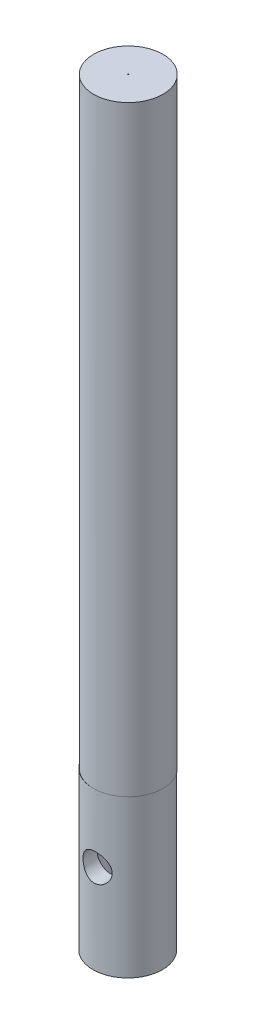
ISO-10303-21;
HEADER;
FILE_DESCRIPTION(('STEP AP214'),'2;1');
FILE_NAME('part.step','',(''),(''),'','','');
FILE_SCHEMA(('AUTOMOTIVE_DESIGN { 1 0 10303 214 1 1 1 1 }'));
ENDSEC;
DATA;
#1=APPLICATION_CONTEXT('core data for automotive mechanical design processes');
#2=APPLICATION_PROTOCOL_DEFINITION('international standard','automotive_design',2000,#1);
#3=PRODUCT_CONTEXT('',#1,'mechanical');
#4=PRODUCT('Part','Part','',(#3));
#5=PRODUCT_RELATED_PRODUCT_CATEGORY('part','',(#4));
#6=PRODUCT_DEFINITION_FORMATION('','',#4);
#7=PRODUCT_DEFINITION_CONTEXT('part definition',#1,'design');
#8=PRODUCT_DEFINITION('design','',#6,#7);
#9=PRODUCT_DEFINITION_SHAPE('','',#8);
#10=(LENGTH_UNIT() NAMED_UNIT(*) SI_UNIT(.MILLI.,.METRE.));
#11=(NAMED_UNIT(*) PLANE_ANGLE_UNIT() SI_UNIT($,.RADIAN.));
#12=(NAMED_UNIT(*) SI_UNIT($,.STERADIAN.) SOLID_ANGLE_UNIT());
#13=UNCERTAINTY_MEASURE_WITH_UNIT(LENGTH_MEASURE(1.E-05),#10,'distance_accuracy_value','');
#14=(GEOMETRIC_REPRESENTATION_CONTEXT(3) GLOBAL_UNCERTAINTY_ASSIGNED_CONTEXT((#13)) GLOBAL_UNIT_ASSIGNED_CONTEXT((#10,
#11,#12)) REPRESENTATION_CONTEXT('',''));
#15=CARTESIAN_POINT('',(0.,0.,0.));
#16=DIRECTION('',(0.,0.,1.));
#17=DIRECTION('',(1.,0.,0.));
#18=AXIS2_PLACEMENT_3D('',#15,#16,#17);
#19=CARTESIAN_POINT('',(0.,17.,0.));
#20=DIRECTION('',(0.,-1.,0.));
#21=DIRECTION('',(0.,0.,-1.));
#22=AXIS2_PLACEMENT_3D('',#19,#20,#21);
#23=CYLINDRICAL_SURFACE('',#22,3.75);
#24=CARTESIAN_POINT('',(0.,17.,0.));
#25=DIRECTION('',(0.,1.,0.));
#26=DIRECTION('',(0.,0.,1.));
#27=AXIS2_PLACEMENT_3D('',#24,#25,#26);
#28=CIRCLE('',#27,3.75);
#29=CARTESIAN_POINT('',(0.0294097277731579,17.,3.74988467394829));
#30=VERTEX_POINT('',#29);
#31=CARTESIAN_POINT('',(0.0294097277731579,17.,-3.7498846739483));
#32=VERTEX_POINT('',#31);
#33=EDGE_CURVE('E11',#30,#32,#28,.T.);
#34=ORIENTED_EDGE('',*,*,#33,.F.);
#35=EDGE_CURVE('E52',#32,#30,#28,.T.);
#36=ORIENTED_EDGE('',*,*,#35,.F.);
#37=EDGE_LOOP('',(#34,#36));
#38=FACE_BOUND('',#37,.T.);
#39=CARTESIAN_POINT('',(0.,0.,0.));
#40=DIRECTION('',(0.,1.,0.));
#41=DIRECTION('',(0.,0.,1.));
#42=AXIS2_PLACEMENT_3D('',#39,#40,#41);
#43=CIRCLE('',#42,3.75);
#44=CARTESIAN_POINT('',(0.,0.,3.75));
#45=VERTEX_POINT('',#44);
#46=EDGE_CURVE('E46',#45,#45,#43,.T.);
#47=ORIENTED_EDGE('',*,*,#46,.T.);
#48=EDGE_LOOP('',(#47));
#49=FACE_BOUND('',#48,.T.);
#50=CARTESIAN_POINT('',(-1.32202326515335,9.67465285179969,3.50923844820971));
#51=CARTESIAN_POINT('',(-1.32201589626779,9.75597211473648,3.5092449833625));
#52=CARTESIAN_POINT('',(-1.31537165802633,9.83743203503399,3.51176686441652));
#53=CARTESIAN_POINT('',(-1.28901716618548,9.99805640948633,3.52152246466492));
#54=CARTESIAN_POINT('',(-1.26927100959532,10.0772139305001,3.52876913016511));
#55=CARTESIAN_POINT('',(-1.21751081823557,10.2306616048012,3.54695812466706));
#56=CARTESIAN_POINT('',(-1.18553696602266,10.3049667772288,3.55788833500497));
#57=CARTESIAN_POINT('',(-1.11031975833972,10.4471584770188,3.58207258294891));
#58=CARTESIAN_POINT('',(-1.06707996510856,10.5150470240585,3.59532588557112));
#59=CARTESIAN_POINT('',(-0.968431155557152,10.645586307249,3.62317106723085));
#60=CARTESIAN_POINT('',(-0.912596105905675,10.7079084464707,3.63779554270533));
#61=CARTESIAN_POINT('',(-0.791213918301998,10.8225378646623,3.66610967296123));
#62=CARTESIAN_POINT('',(-0.725664290901052,10.8748425686747,3.67979908680708));
#63=CARTESIAN_POINT('',(-0.58488338416496,10.9690126083531,3.70481104531085));
#64=CARTESIAN_POINT('',(-0.509472652910873,11.0106263582772,3.71607568445454));
#65=CARTESIAN_POINT('',(-0.352204004483899,11.0804628671395,3.7342607745824));
#66=CARTESIAN_POINT('',(-0.270348954579175,11.1086915426691,3.74118314541296));
#67=CARTESIAN_POINT('',(-0.106985092966225,11.1496188801953,3.74931997575387));
#68=CARTESIAN_POINT('',(-0.025668847979815,11.1630318957116,3.75080585203465));
#69=CARTESIAN_POINT('',(0.137970696071136,11.1763630857113,3.74835332074436));
#70=CARTESIAN_POINT('',(0.220293724744295,11.1762848072745,3.74441633920045));
#71=CARTESIAN_POINT('',(0.379892010967172,11.1630647701177,3.73153099272544));
#72=CARTESIAN_POINT('',(0.457232687635037,11.1504811093921,3.72280385131233));
#73=CARTESIAN_POINT('',(0.608454346663981,11.1136622000003,3.70109749140791));
#74=CARTESIAN_POINT('',(0.682334865944777,11.0894253966314,3.68811770562413));
#75=CARTESIAN_POINT('',(0.827134994489595,11.0292495151246,3.65841250037188));
#76=CARTESIAN_POINT('',(0.897891352060574,10.9929703305543,3.64158325893158));
#77=CARTESIAN_POINT('',(1.03243037822926,10.9100316323266,3.60575128722892));
#78=CARTESIAN_POINT('',(1.0962101921505,10.8633678930187,3.58674767371164));
#79=CARTESIAN_POINT('',(1.21997887870232,10.7569529960939,3.54664490347679));
#80=CARTESIAN_POINT('',(1.27934074808467,10.6964902045421,3.52549459013083));
#81=CARTESIAN_POINT('',(1.38725727732642,10.566169031145,3.48444513725598));
#82=CARTESIAN_POINT('',(1.43580811450151,10.4963073398955,3.46454644206691));
#83=CARTESIAN_POINT('',(1.52159627941963,10.3471389284018,3.42775074073817));
#84=CARTESIAN_POINT('',(1.55857716106084,10.2676659176397,3.41092481318878));
#85=CARTESIAN_POINT('',(1.61830121316778,10.1026112414061,3.38300216351146));
#86=CARTESIAN_POINT('',(1.64105770834727,10.0170353767828,3.37190008127693));
#87=CARTESIAN_POINT('',(1.66991704354439,9.84986403207212,3.35769485211904));
#88=CARTESIAN_POINT('',(1.67724974613034,9.76853120142168,3.35400218240705));
#89=CARTESIAN_POINT('',(1.67859984460473,9.60573981596635,3.35332765309465));
#90=CARTESIAN_POINT('',(1.67262169028035,9.52428131227104,3.35634355083609));
#91=CARTESIAN_POINT('',(1.64854150929326,9.36943560723652,3.36822911716928));
#92=CARTESIAN_POINT('',(1.63130171861137,9.29587863474108,3.37668185969006));
#93=CARTESIAN_POINT('',(1.58626264017542,9.15277001925977,3.39807124277222));
#94=CARTESIAN_POINT('',(1.5584607515632,9.08321936767009,3.41100898767189));
#95=CARTESIAN_POINT('',(1.49148142147848,8.94607113781215,3.44084153804676));
#96=CARTESIAN_POINT('',(1.45178619752872,8.87876473554394,3.45790756706881));
#97=CARTESIAN_POINT('',(1.36275393297037,8.75142734862554,3.49395289269719));
#98=CARTESIAN_POINT('',(1.31341236915733,8.69139979853358,3.51293308483246));
#99=CARTESIAN_POINT('',(1.2010115550257,8.57438509360787,3.55302052572672));
#100=CARTESIAN_POINT('',(1.13709414261676,8.51822948889112,3.57415844987112));
#101=CARTESIAN_POINT('',(1.0003443150329,8.41730090665661,3.6148162224331));
#102=CARTESIAN_POINT('',(0.927510377881122,8.37252987641575,3.63433579365487));
#103=CARTESIAN_POINT('',(0.773554041964798,8.29523191772092,3.67020941724371));
#104=CARTESIAN_POINT('',(0.69233262404732,8.26287929381885,3.68651694442219));
#105=CARTESIAN_POINT('',(0.524721580028784,8.21266484372593,3.71407621330002));
#106=CARTESIAN_POINT('',(0.438335046322571,8.19479443837806,3.7253309464712));
#107=CARTESIAN_POINT('',(0.269291016125679,8.17518861518339,3.74121455612787));
#108=CARTESIAN_POINT('',(0.186791187633859,8.17241884778092,3.74624930189894));
#109=CARTESIAN_POINT('',(0.0223149662846328,8.18048303321385,3.75083510600836));
#110=CARTESIAN_POINT('',(-0.0596615522364951,8.191313586391,3.75038753451116));
#111=CARTESIAN_POINT('',(-0.216820533794648,8.22540980026783,3.74451541902612));
#112=CARTESIAN_POINT('',(-0.292142091781531,8.2480810826782,3.73932055580802));
#113=CARTESIAN_POINT('',(-0.43800602685049,8.30472978979376,3.7250537466226));
#114=CARTESIAN_POINT('',(-0.508547703868384,8.33870886635571,3.71598123414832));
#115=CARTESIAN_POINT('',(-0.645282956067448,8.41819296581196,3.69473260195947));
#116=CARTESIAN_POINT('',(-0.711273329024165,8.46402330873757,3.68246880846398));
#117=CARTESIAN_POINT('',(-0.834946489461508,8.5654253337796,3.65641423173278));
#118=CARTESIAN_POINT('',(-0.892627054851074,8.62099961270607,3.6426230417997));
#119=CARTESIAN_POINT('',(-1.00150896653278,8.74408871733487,3.61425364096379));
#120=CARTESIAN_POINT('',(-1.05214046338598,8.81210915009633,3.59967617747586));
#121=CARTESIAN_POINT('',(-1.14139981879309,8.95603191724068,3.57237938913415));
#122=CARTESIAN_POINT('',(-1.18002045043033,9.03193896048387,3.55966118542297));
#123=CARTESIAN_POINT('',(-1.24405415185626,9.18978350717959,3.53779345334423));
#124=CARTESIAN_POINT('',(-1.26944381105053,9.27173140883017,3.52865025760446));
#125=CARTESIAN_POINT('',(-1.30584994672832,9.43898999095446,3.51534448688604));
#126=CARTESIAN_POINT('',(-1.31691148620627,9.52428925479378,3.5111663000292));
#127=CARTESIAN_POINT('',(-1.32155755349437,9.63139940384139,3.50941295997743));
#128=CARTESIAN_POINT('',(-1.32202522534728,9.65302115128713,3.50923670979666));
#129=CARTESIAN_POINT('',(-1.32202326515335,9.67465285179969,3.50923844820971));
#130=B_SPLINE_CURVE_WITH_KNOTS('',3,(#50,#51,#52,#53,#54,#55,#56,#57,#58,#59,#60,#61,#62,#63,
#64,#65,#66,#67,#68,#69,#70,#71,#72,#73,#74,#75,#76,#77,#78,#79,#80,#81,#82,#83,#84,#85,#86,#87,
#88,#89,#90,#91,#92,#93,#94,#95,#96,#97,#98,#99,#100,#101,#102,#103,#104,#105,#106,#107,#108,
#109,#110,#111,#112,#113,#114,#115,#116,#117,#118,#119,#120,#121,#122,#123,#124,#125,#126,#127,
#128,#129),.UNSPECIFIED.,.T.,.F.,(4,2,2,2,2,2,2,2,2,2,2,2,2,2,2,2,2,2,2,2,2,2,2,2,2,2,2,2,2,2,2,
2,2,2,2,2,2,2,2,4),(0.,0.243899564642712,0.488470259209473,0.732244059340601,0.975940872661174,
1.22962307512829,1.48337039873166,1.74263245722737,2.00177980728713,2.2477977276057,
2.49375096592811,2.72919927873881,2.96467901258178,3.20747310709087,3.45036617985747,
3.71118216493562,3.9720902262859,4.23842752482481,4.50451495615396,4.74842658958201,
4.9922566961852,5.21931475068212,5.44642875324677,5.68539098600088,5.9244655389487,
6.18626812297083,6.44811545699453,6.71351426426867,6.97875573612921,7.22557678915959,
7.47233615686321,7.70775477386444,7.94320779621973,8.18597660425709,8.42881021007214,
8.68572848417434,8.94280104779684,9.20032693868654,9.457040909178,9.52192052253107),.UNSPECIFIED.);
#131=CARTESIAN_POINT('',(-1.32202326515335,9.67465285179969,3.50923844820971));
#132=VERTEX_POINT('',#131);
#133=EDGE_CURVE('E90',#132,#132,#130,.T.);
#134=ORIENTED_EDGE('',*,*,#133,.T.);
#135=EDGE_LOOP('',(#134));
#136=FACE_BOUND('',#135,.T.);
#137=ADVANCED_FACE('F43',(#38,#49,#136),#23,.T.);
#138=CARTESIAN_POINT('',(0.,17.,0.));
#139=DIRECTION('',(0.,-1.,0.));
#140=DIRECTION('',(0.,0.,-1.));
#141=AXIS2_PLACEMENT_3D('',#138,#139,#140);
#142=CYLINDRICAL_SURFACE('',#141,2.5);
#143=DIRECTION('',(0.,-1.,0.));
#144=VECTOR('',#143,1.);
#145=CARTESIAN_POINT('',(1.5,17.,2.));
#146=LINE('',#145,#144);
#147=CARTESIAN_POINT('',(1.5,8.96595370096538,2.));
#148=VERTEX_POINT('',#147);
#149=CARTESIAN_POINT('',(1.5,0.,2.));
#150=VERTEX_POINT('',#149);
#151=EDGE_CURVE('E98',#148,#150,#146,.T.);
#152=ORIENTED_EDGE('',*,*,#151,.F.);
#153=CARTESIAN_POINT('',(1.5,10.383352002634,2.));
#154=CARTESIAN_POINT('',(1.53171940858297,10.3242377149711,1.97620604747248));
#155=CARTESIAN_POINT('',(1.55979647895398,10.2622719227403,1.95396496635177));
#156=CARTESIAN_POINT('',(1.60782848824365,10.1332189526522,1.91464619148955));
#157=CARTESIAN_POINT('',(1.62772422413215,10.0660984766697,1.8976063564786));
#158=CARTESIAN_POINT('',(1.65818173445838,9.927705856821,1.87105682570203));
#159=CARTESIAN_POINT('',(1.66867722341008,9.85640794925068,1.86160065393275));
#160=CARTESIAN_POINT('',(1.67921313627859,9.71270182706211,1.85210774238338));
#161=CARTESIAN_POINT('',(1.67929993631774,9.64029997511125,1.85202922030327));
#162=CARTESIAN_POINT('',(1.66970654141512,9.50481630671633,1.86067319568267));
#163=CARTESIAN_POINT('',(1.66110344199692,9.44158791974703,1.86842512826925));
#164=CARTESIAN_POINT('',(1.63624075948463,9.31761558646384,1.89023436614312));
#165=CARTESIAN_POINT('',(1.61995856741601,9.25687955603011,1.90431028482907));
#166=CARTESIAN_POINT('',(1.5866078601879,9.15734902823184,1.93209394796759));
#167=CARTESIAN_POINT('',(1.57133940649865,9.11757725408972,1.94456959582954));
#168=CARTESIAN_POINT('',(1.537837656874,9.04019164317975,1.97117017883423));
#169=CARTESIAN_POINT('',(1.51962324728092,9.00256599965561,1.98528445607071));
#170=CARTESIAN_POINT('',(1.5,8.96595370096538,2.));
#171=B_SPLINE_CURVE_WITH_KNOTS('',3,(#153,#154,#155,#156,#157,#158,#159,#160,#161,#162,#163,
#164,#165,#166,#167,#168,#169,#170),.UNSPECIFIED.,.F.,.F.,(4,2,2,2,2,2,2,2,4),(0.,
0.213733070827382,0.428986669687385,0.645746436095565,0.861540388967377,1.053513407713,
1.24605520069324,1.37905815365663,1.51123997173023),.UNSPECIFIED.);
#172=CARTESIAN_POINT('',(1.5,10.383352002634,2.));
#173=VERTEX_POINT('',#172);
#174=EDGE_CURVE('E58',#173,#148,#171,.T.);
#175=ORIENTED_EDGE('',*,*,#174,.F.);
#176=CARTESIAN_POINT('',(1.5,17.,2.));
#177=VERTEX_POINT('',#176);
#178=EDGE_CURVE('E96',#177,#173,#146,.T.);
#179=ORIENTED_EDGE('',*,*,#178,.F.);
#180=CARTESIAN_POINT('',(0.,17.,0.));
#181=DIRECTION('',(0.,1.,0.));
#182=DIRECTION('',(0.,0.,1.));
#183=AXIS2_PLACEMENT_3D('',#180,#181,#182);
#184=CIRCLE('',#183,2.5);
#185=CARTESIAN_POINT('',(-1.5,17.,2.));
#186=VERTEX_POINT('',#185);
#187=EDGE_CURVE('E118',#177,#186,#184,.T.);
#188=ORIENTED_EDGE('',*,*,#187,.T.);
#189=DIRECTION('',(0.,-1.,0.));
#190=VECTOR('',#189,1.);
#191=CARTESIAN_POINT('',(-1.5,17.,2.));
#192=LINE('',#191,#190);
#193=CARTESIAN_POINT('',(-1.5,0.,2.));
#194=VERTEX_POINT('',#193);
#195=EDGE_CURVE('E107',#186,#194,#192,.T.);
#196=ORIENTED_EDGE('',*,*,#195,.T.);
#197=CARTESIAN_POINT('',(0.,0.,0.));
#198=DIRECTION('',(0.,1.,0.));
#199=DIRECTION('',(0.,0.,1.));
#200=AXIS2_PLACEMENT_3D('',#197,#198,#199);
#201=CIRCLE('',#200,2.5);
#202=EDGE_CURVE('E119',#150,#194,#201,.T.);
#203=ORIENTED_EDGE('',*,*,#202,.F.);
#204=EDGE_LOOP('',(#152,#175,#179,#188,#196,#203));
#205=FACE_BOUND('',#204,.T.);
#206=ADVANCED_FACE('F94',(#205),#142,.F.);
#207=CARTESIAN_POINT('',(0.,17.,0.));
#208=DIRECTION('',(0.,1.,0.));
#209=DIRECTION('',(0.,0.,1.));
#210=AXIS2_PLACEMENT_3D('',#207,#208,#209);
#211=PLANE('',#210);
#212=CARTESIAN_POINT('',(0.0588194555463158,17.,0.));
#213=DIRECTION('',(0.,1.,0.));
#214=DIRECTION('',(0.,0.,1.));
#215=AXIS2_PLACEMENT_3D('',#212,#213,#214);
#216=CIRCLE('',#215,3.75);
#217=EDGE_CURVE('E65',#32,#30,#216,.T.);
#218=ORIENTED_EDGE('',*,*,#217,.F.);
#219=ORIENTED_EDGE('',*,*,#35,.T.);
#220=EDGE_LOOP('',(#218,#219));
#221=FACE_BOUND('',#220,.T.);
#222=ADVANCED_FACE('F181',(#221),#211,.T.);
#223=CARTESIAN_POINT('',(0.,0.,0.));
#224=DIRECTION('',(0.,1.,0.));
#225=DIRECTION('',(0.,0.,1.));
#226=AXIS2_PLACEMENT_3D('',#223,#224,#225);
#227=PLANE('',#226);
#228=ORIENTED_EDGE('',*,*,#46,.F.);
#229=EDGE_LOOP('',(#228));
#230=FACE_BOUND('',#229,.T.);
#231=ORIENTED_EDGE('',*,*,#202,.T.);
#232=DIRECTION('',(1.,0.,0.));
#233=VECTOR('',#232,1.);
#234=CARTESIAN_POINT('',(1.5,0.,2.));
#235=LINE('',#234,#233);
#236=EDGE_CURVE('E114',#194,#150,#235,.T.);
#237=ORIENTED_EDGE('',*,*,#236,.T.);
#238=EDGE_LOOP('',(#231,#237));
#239=FACE_BOUND('',#238,.T.);
#240=ADVANCED_FACE('F178',(#230,#239),#227,.F.);
#241=CARTESIAN_POINT('',(1.5,17.,2.));
#242=DIRECTION('',(0.,0.,-1.));
#243=DIRECTION('',(-1.,0.,0.));
#244=AXIS2_PLACEMENT_3D('',#241,#242,#243);
#245=PLANE('',#244);
#246=ORIENTED_EDGE('',*,*,#178,.T.);
#247=CARTESIAN_POINT('',(0.177976734846652,9.67465285179969,2.));
#248=DIRECTION('',(0.,0.,-1.));
#249=DIRECTION('',(-1.,0.,0.));
#250=AXIS2_PLACEMENT_3D('',#247,#248,#249);
#251=CIRCLE('',#250,1.5);
#252=EDGE_CURVE('E83',#148,#173,#251,.T.);
#253=ORIENTED_EDGE('',*,*,#252,.F.);
#254=ORIENTED_EDGE('',*,*,#151,.T.);
#255=ORIENTED_EDGE('',*,*,#236,.F.);
#256=ORIENTED_EDGE('',*,*,#195,.F.);
#257=DIRECTION('',(1.,0.,0.));
#258=VECTOR('',#257,1.);
#259=CARTESIAN_POINT('',(1.5,17.,2.));
#260=LINE('',#259,#258);
#261=EDGE_CURVE('E105',#186,#177,#260,.T.);
#262=ORIENTED_EDGE('',*,*,#261,.T.);
#263=EDGE_LOOP('',(#246,#253,#254,#255,#256,#262));
#264=FACE_BOUND('',#263,.T.);
#265=ADVANCED_FACE('F103',(#264),#245,.T.);
#266=CARTESIAN_POINT('',(0.0588194555463158,17.,0.));
#267=DIRECTION('',(0.,1.,0.));
#268=DIRECTION('',(0.,0.,1.));
#269=AXIS2_PLACEMENT_3D('',#266,#267,#268);
#270=PLANE('',#269);
#271=EDGE_CURVE('E130',#30,#32,#216,.T.);
#272=ORIENTED_EDGE('',*,*,#271,.F.);
#273=ORIENTED_EDGE('',*,*,#33,.T.);
#274=EDGE_LOOP('',(#272,#273));
#275=FACE_BOUND('',#274,.T.);
#276=ADVANCED_FACE('F168',(#275),#270,.F.);
#277=CARTESIAN_POINT('',(0.0588194555463158,82.,0.));
#278=DIRECTION('',(0.,1.,0.));
#279=DIRECTION('',(0.,0.,1.));
#280=AXIS2_PLACEMENT_3D('',#277,#278,#279);
#281=PLANE('',#280);
#282=CARTESIAN_POINT('',(0.0588194555463158,82.,0.));
#283=DIRECTION('',(0.,1.,0.));
#284=DIRECTION('',(0.,0.,1.));
#285=AXIS2_PLACEMENT_3D('',#282,#283,#284);
#286=CIRCLE('',#285,3.75);
#287=CARTESIAN_POINT('',(0.0588194555463158,82.,3.75));
#288=VERTEX_POINT('',#287);
#289=EDGE_CURVE('E123',#288,#288,#286,.T.);
#290=ORIENTED_EDGE('',*,*,#289,.T.);
#291=EDGE_LOOP('',(#290));
#292=FACE_BOUND('',#291,.T.);
#293=CARTESIAN_POINT('',(0.0588194555463158,82.,0.));
#294=DIRECTION('',(0.,1.,0.));
#295=DIRECTION('',(0.,0.,1.));
#296=AXIS2_PLACEMENT_3D('',#293,#294,#295);
#297=CIRCLE('',#296,0.0588194555463158);
#298=CARTESIAN_POINT('',(0.0588194555463158,82.,0.0588194555463158));
#299=VERTEX_POINT('',#298);
#300=EDGE_CURVE('E137',#299,#299,#297,.T.);
#301=ORIENTED_EDGE('',*,*,#300,.F.);
#302=EDGE_LOOP('',(#301));
#303=FACE_BOUND('',#302,.T.);
#304=ADVANCED_FACE('F164',(#292,#303),#281,.T.);
#305=ORIENTED_EDGE('',*,*,#261,.F.);
#306=ORIENTED_EDGE('',*,*,#187,.F.);
#307=EDGE_LOOP('',(#305,#306));
#308=FACE_BOUND('',#307,.T.);
#309=CARTESIAN_POINT('',(0.0588194555463158,17.,0.));
#310=DIRECTION('',(0.,1.,0.));
#311=DIRECTION('',(0.,0.,1.));
#312=AXIS2_PLACEMENT_3D('',#309,#310,#311);
#313=CIRCLE('',#312,0.0588194555463158);
#314=CARTESIAN_POINT('',(0.0588194555463158,17.,0.0588194555463158));
#315=VERTEX_POINT('',#314);
#316=EDGE_CURVE('E100',#315,#315,#313,.T.);
#317=ORIENTED_EDGE('',*,*,#316,.T.);
#318=EDGE_LOOP('',(#317));
#319=FACE_BOUND('',#318,.T.);
#320=ADVANCED_FACE('F167',(#308,#319),#270,.F.);
#321=CARTESIAN_POINT('',(0.0588194555463158,82.,0.));
#322=DIRECTION('',(0.,-1.,0.));
#323=DIRECTION('',(0.,0.,-1.));
#324=AXIS2_PLACEMENT_3D('',#321,#322,#323);
#325=CYLINDRICAL_SURFACE('',#324,3.75);
#326=ORIENTED_EDGE('',*,*,#289,.F.);
#327=EDGE_LOOP('',(#326));
#328=FACE_BOUND('',#327,.T.);
#329=ORIENTED_EDGE('',*,*,#217,.T.);
#330=ORIENTED_EDGE('',*,*,#271,.T.);
#331=EDGE_LOOP('',(#329,#330));
#332=FACE_BOUND('',#331,.T.);
#333=ADVANCED_FACE('F162',(#328,#332),#325,.T.);
#334=CARTESIAN_POINT('',(0.0588194555463158,82.,0.));
#335=DIRECTION('',(0.,-1.,0.));
#336=DIRECTION('',(0.,0.,-1.));
#337=AXIS2_PLACEMENT_3D('',#334,#335,#336);
#338=CYLINDRICAL_SURFACE('',#337,0.0588194555463158);
#339=ORIENTED_EDGE('',*,*,#300,.T.);
#340=EDGE_LOOP('',(#339));
#341=FACE_BOUND('',#340,.T.);
#342=ORIENTED_EDGE('',*,*,#316,.F.);
#343=EDGE_LOOP('',(#342));
#344=FACE_BOUND('',#343,.T.);
#345=ADVANCED_FACE('F158',(#341,#344),#338,.F.);
#346=CARTESIAN_POINT('',(0.177976734846652,9.67465285179969,3.751));
#347=DIRECTION('',(0.,0.,-1.));
#348=DIRECTION('',(-1.,0.,0.));
#349=AXIS2_PLACEMENT_3D('',#346,#347,#348);
#350=CYLINDRICAL_SURFACE('',#349,1.5);
#351=ORIENTED_EDGE('',*,*,#174,.T.);
#352=ORIENTED_EDGE('',*,*,#252,.T.);
#353=EDGE_LOOP('',(#351,#352));
#354=FACE_BOUND('',#353,.T.);
#355=ORIENTED_EDGE('',*,*,#133,.F.);
#356=EDGE_LOOP('',(#355));
#357=FACE_BOUND('',#356,.T.);
#358=ADVANCED_FACE('F84',(#354,#357),#350,.F.);
#359=CLOSED_SHELL('',(#137,#206,#222,#240,#265,#276,#304,#320,#333,#345,#358));
#360=MANIFOLD_SOLID_BREP('B2',#359);
#361=ADVANCED_BREP_SHAPE_REPRESENTATION('',(#18,#360),#14);
#362=SHAPE_DEFINITION_REPRESENTATION(#9,#361);
ENDSEC;
END-ISO-10303-21;
